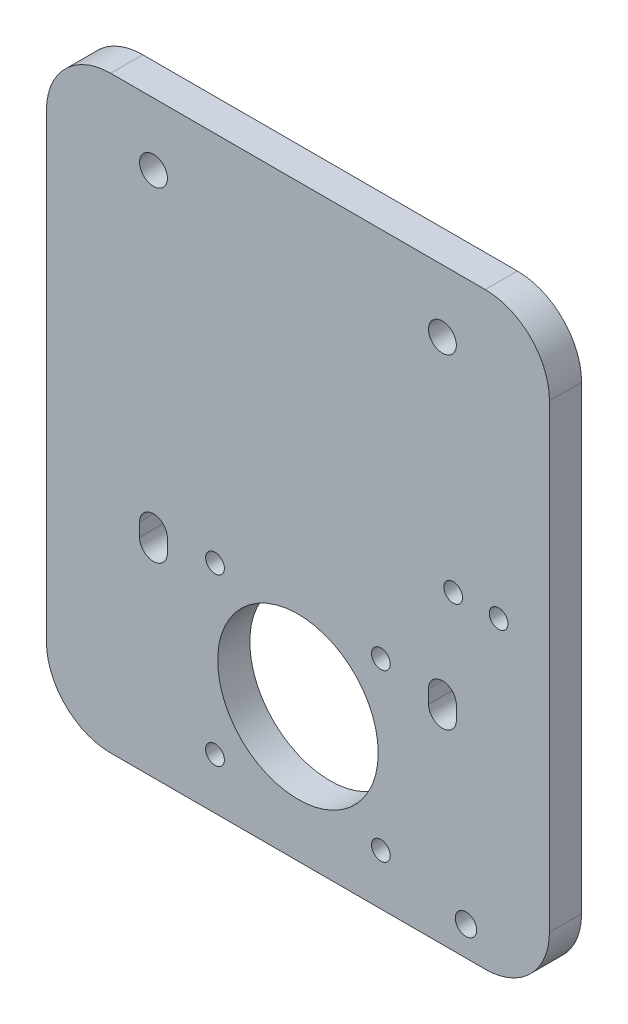
ISO-10303-21;
HEADER;
FILE_DESCRIPTION(('STEP AP214'),'2;1');
FILE_NAME('part.step','',(''),(''),'','','');
FILE_SCHEMA(('AUTOMOTIVE_DESIGN { 1 0 10303 214 1 1 1 1 }'));
ENDSEC;
DATA;
#1=APPLICATION_CONTEXT('core data for automotive mechanical design processes');
#2=APPLICATION_PROTOCOL_DEFINITION('international standard','automotive_design',2000,#1);
#3=PRODUCT_CONTEXT('',#1,'mechanical');
#4=PRODUCT('Part','Part','',(#3));
#5=PRODUCT_RELATED_PRODUCT_CATEGORY('part','',(#4));
#6=PRODUCT_DEFINITION_FORMATION('','',#4);
#7=PRODUCT_DEFINITION_CONTEXT('part definition',#1,'design');
#8=PRODUCT_DEFINITION('design','',#6,#7);
#9=PRODUCT_DEFINITION_SHAPE('','',#8);
#10=(LENGTH_UNIT() NAMED_UNIT(*) SI_UNIT(.MILLI.,.METRE.));
#11=(NAMED_UNIT(*) PLANE_ANGLE_UNIT() SI_UNIT($,.RADIAN.));
#12=(NAMED_UNIT(*) SI_UNIT($,.STERADIAN.) SOLID_ANGLE_UNIT());
#13=UNCERTAINTY_MEASURE_WITH_UNIT(LENGTH_MEASURE(1.E-05),#10,'distance_accuracy_value','');
#14=(GEOMETRIC_REPRESENTATION_CONTEXT(3) GLOBAL_UNCERTAINTY_ASSIGNED_CONTEXT((#13)) GLOBAL_UNIT_ASSIGNED_CONTEXT((#10,
#11,#12)) REPRESENTATION_CONTEXT('',''));
#15=CARTESIAN_POINT('',(0.,0.,0.));
#16=DIRECTION('',(0.,0.,1.));
#17=DIRECTION('',(1.,0.,0.));
#18=AXIS2_PLACEMENT_3D('',#15,#16,#17);
#19=CARTESIAN_POINT('',(27.,37.6,6.));
#20=DIRECTION('',(0.,0.,-1.));
#21=DIRECTION('',(-1.,0.,0.));
#22=AXIS2_PLACEMENT_3D('',#19,#20,#21);
#23=CYLINDRICAL_SURFACE('',#22,2.60000000000222);
#24=CARTESIAN_POINT('',(27.,37.6,0.));
#25=DIRECTION('',(0.,0.,1.));
#26=DIRECTION('',(1.,0.,0.));
#27=AXIS2_PLACEMENT_3D('',#24,#25,#26);
#28=CIRCLE('',#27,2.60000000000222);
#29=CARTESIAN_POINT('',(24.3999999999978,37.6,0.));
#30=VERTEX_POINT('',#29);
#31=CARTESIAN_POINT('',(29.6000000000022,37.6,0.));
#32=VERTEX_POINT('',#31);
#33=EDGE_CURVE('E243',#30,#32,#28,.T.);
#34=ORIENTED_EDGE('',*,*,#33,.F.);
#35=DIRECTION('',(0.,0.,-1.));
#36=VECTOR('',#35,1.);
#37=CARTESIAN_POINT('',(24.3999999999978,37.6,6.));
#38=LINE('',#37,#36);
#39=CARTESIAN_POINT('',(24.3999999999978,37.6,6.));
#40=VERTEX_POINT('',#39);
#41=EDGE_CURVE('E11',#40,#30,#38,.T.);
#42=ORIENTED_EDGE('',*,*,#41,.F.);
#43=CARTESIAN_POINT('',(27.,37.6,6.));
#44=DIRECTION('',(0.,0.,1.));
#45=DIRECTION('',(1.,0.,0.));
#46=AXIS2_PLACEMENT_3D('',#43,#44,#45);
#47=CIRCLE('',#46,2.60000000000222);
#48=CARTESIAN_POINT('',(29.6000000000022,37.6,6.));
#49=VERTEX_POINT('',#48);
#50=EDGE_CURVE('E177',#40,#49,#47,.T.);
#51=ORIENTED_EDGE('',*,*,#50,.T.);
#52=DIRECTION('',(0.,0.,-1.));
#53=VECTOR('',#52,1.);
#54=CARTESIAN_POINT('',(29.6000000000022,37.6,6.));
#55=LINE('',#54,#53);
#56=EDGE_CURVE('E57',#49,#32,#55,.T.);
#57=ORIENTED_EDGE('',*,*,#56,.T.);
#58=EDGE_LOOP('',(#34,#42,#51,#57));
#59=FACE_BOUND('',#58,.T.);
#60=ADVANCED_FACE('F38',(#59),#23,.F.);
#61=CARTESIAN_POINT('',(24.3999999999978,0.,6.));
#62=DIRECTION('',(1.,0.,0.));
#63=DIRECTION('',(0.,0.,-1.));
#64=AXIS2_PLACEMENT_3D('',#61,#62,#63);
#65=PLANE('',#64);
#66=DIRECTION('',(0.,-1.,0.));
#67=VECTOR('',#66,1.);
#68=CARTESIAN_POINT('',(24.3999999999978,0.,0.));
#69=LINE('',#68,#67);
#70=CARTESIAN_POINT('',(24.3999999999978,40.1000000000124,0.));
#71=VERTEX_POINT('',#70);
#72=EDGE_CURVE('E164',#71,#30,#69,.T.);
#73=ORIENTED_EDGE('',*,*,#72,.F.);
#74=DIRECTION('',(0.,0.,-1.));
#75=VECTOR('',#74,1.);
#76=CARTESIAN_POINT('',(24.3999999999978,40.1000000000124,6.));
#77=LINE('',#76,#75);
#78=CARTESIAN_POINT('',(24.3999999999978,40.1000000000124,6.));
#79=VERTEX_POINT('',#78);
#80=EDGE_CURVE('E48',#79,#71,#77,.T.);
#81=ORIENTED_EDGE('',*,*,#80,.F.);
#82=DIRECTION('',(0.,-1.,0.));
#83=VECTOR('',#82,1.);
#84=CARTESIAN_POINT('',(24.3999999999978,0.,6.));
#85=LINE('',#84,#83);
#86=EDGE_CURVE('E162',#79,#40,#85,.T.);
#87=ORIENTED_EDGE('',*,*,#86,.T.);
#88=ORIENTED_EDGE('',*,*,#41,.T.);
#89=EDGE_LOOP('',(#73,#81,#87,#88));
#90=FACE_BOUND('',#89,.T.);
#91=ADVANCED_FACE('F160',(#90),#65,.T.);
#92=CARTESIAN_POINT('',(27.,40.1000000000124,6.));
#93=DIRECTION('',(0.,0.,-1.));
#94=DIRECTION('',(-1.,0.,0.));
#95=AXIS2_PLACEMENT_3D('',#92,#93,#94);
#96=CYLINDRICAL_SURFACE('',#95,2.60000000000222);
#97=CARTESIAN_POINT('',(27.,40.1000000000124,0.));
#98=DIRECTION('',(0.,0.,1.));
#99=DIRECTION('',(1.,0.,0.));
#100=AXIS2_PLACEMENT_3D('',#97,#98,#99);
#101=CIRCLE('',#100,2.60000000000222);
#102=CARTESIAN_POINT('',(29.6000000000022,40.1000000000124,0.));
#103=VERTEX_POINT('',#102);
#104=EDGE_CURVE('E246',#71,#103,#101,.F.);
#105=ORIENTED_EDGE('',*,*,#104,.T.);
#106=DIRECTION('',(0.,0.,-1.));
#107=VECTOR('',#106,1.);
#108=CARTESIAN_POINT('',(29.6000000000022,40.1000000000124,6.));
#109=LINE('',#108,#107);
#110=CARTESIAN_POINT('',(29.6000000000022,40.1000000000124,6.));
#111=VERTEX_POINT('',#110);
#112=EDGE_CURVE('E107',#111,#103,#109,.T.);
#113=ORIENTED_EDGE('',*,*,#112,.F.);
#114=CARTESIAN_POINT('',(27.,40.1000000000124,6.));
#115=DIRECTION('',(0.,0.,1.));
#116=DIRECTION('',(1.,0.,0.));
#117=AXIS2_PLACEMENT_3D('',#114,#115,#116);
#118=CIRCLE('',#117,2.60000000000222);
#119=EDGE_CURVE('E168',#79,#111,#118,.F.);
#120=ORIENTED_EDGE('',*,*,#119,.F.);
#121=ORIENTED_EDGE('',*,*,#80,.T.);
#122=EDGE_LOOP('',(#105,#113,#120,#121));
#123=FACE_BOUND('',#122,.T.);
#124=ADVANCED_FACE('F169',(#123),#96,.F.);
#125=CARTESIAN_POINT('',(-35.,98.,6.));
#126=DIRECTION('',(0.,0.,-1.));
#127=DIRECTION('',(-1.,0.,0.));
#128=AXIS2_PLACEMENT_3D('',#125,#126,#127);
#129=CYLINDRICAL_SURFACE('',#128,12.);
#130=CARTESIAN_POINT('',(-35.,98.,0.));
#131=DIRECTION('',(0.,0.,1.));
#132=DIRECTION('',(1.,0.,0.));
#133=AXIS2_PLACEMENT_3D('',#130,#131,#132);
#134=CIRCLE('',#133,12.);
#135=CARTESIAN_POINT('',(-47.,98.,0.));
#136=VERTEX_POINT('',#135);
#137=CARTESIAN_POINT('',(-35.,110.,0.));
#138=VERTEX_POINT('',#137);
#139=EDGE_CURVE('E210',#136,#138,#134,.F.);
#140=ORIENTED_EDGE('',*,*,#139,.F.);
#141=DIRECTION('',(0.,0.,-1.));
#142=VECTOR('',#141,1.);
#143=CARTESIAN_POINT('',(-47.,98.,6.));
#144=LINE('',#143,#142);
#145=CARTESIAN_POINT('',(-47.,98.,6.));
#146=VERTEX_POINT('',#145);
#147=EDGE_CURVE('E259',#146,#136,#144,.T.);
#148=ORIENTED_EDGE('',*,*,#147,.F.);
#149=CARTESIAN_POINT('',(-35.,98.,6.));
#150=DIRECTION('',(0.,0.,1.));
#151=DIRECTION('',(1.,0.,0.));
#152=AXIS2_PLACEMENT_3D('',#149,#150,#151);
#153=CIRCLE('',#152,12.);
#154=CARTESIAN_POINT('',(-35.,110.,6.));
#155=VERTEX_POINT('',#154);
#156=EDGE_CURVE('E311',#146,#155,#153,.F.);
#157=ORIENTED_EDGE('',*,*,#156,.T.);
#158=DIRECTION('',(0.,0.,-1.));
#159=VECTOR('',#158,1.);
#160=CARTESIAN_POINT('',(-35.,110.,6.));
#161=LINE('',#160,#159);
#162=EDGE_CURVE('E261',#155,#138,#161,.T.);
#163=ORIENTED_EDGE('',*,*,#162,.T.);
#164=EDGE_LOOP('',(#140,#148,#157,#163));
#165=FACE_BOUND('',#164,.T.);
#166=ADVANCED_FACE('F408',(#165),#129,.T.);
#167=CARTESIAN_POINT('',(-47.,0.,6.));
#168=DIRECTION('',(-1.,0.,0.));
#169=DIRECTION('',(0.,-1.,0.));
#170=AXIS2_PLACEMENT_3D('',#167,#168,#169);
#171=PLANE('',#170);
#172=DIRECTION('',(0.,1.,0.));
#173=VECTOR('',#172,1.);
#174=CARTESIAN_POINT('',(-47.,0.,0.));
#175=LINE('',#174,#173);
#176=CARTESIAN_POINT('',(-47.,12.0000000000009,0.));
#177=VERTEX_POINT('',#176);
#178=EDGE_CURVE('E213',#177,#136,#175,.T.);
#179=ORIENTED_EDGE('',*,*,#178,.F.);
#180=DIRECTION('',(0.,0.,-1.));
#181=VECTOR('',#180,1.);
#182=CARTESIAN_POINT('',(-47.,12.0000000000009,6.));
#183=LINE('',#182,#181);
#184=CARTESIAN_POINT('',(-47.,12.0000000000009,6.));
#185=VERTEX_POINT('',#184);
#186=EDGE_CURVE('E273',#185,#177,#183,.T.);
#187=ORIENTED_EDGE('',*,*,#186,.F.);
#188=DIRECTION('',(0.,1.,0.));
#189=VECTOR('',#188,1.);
#190=CARTESIAN_POINT('',(-47.,0.,6.));
#191=LINE('',#190,#189);
#192=EDGE_CURVE('E314',#185,#146,#191,.T.);
#193=ORIENTED_EDGE('',*,*,#192,.T.);
#194=ORIENTED_EDGE('',*,*,#147,.T.);
#195=EDGE_LOOP('',(#179,#187,#193,#194));
#196=FACE_BOUND('',#195,.T.);
#197=ADVANCED_FACE('F404',(#196),#171,.T.);
#198=CARTESIAN_POINT('',(-35.,12.0000000000009,6.));
#199=DIRECTION('',(0.,0.,-1.));
#200=DIRECTION('',(-1.,0.,0.));
#201=AXIS2_PLACEMENT_3D('',#198,#199,#200);
#202=CYLINDRICAL_SURFACE('',#201,12.);
#203=CARTESIAN_POINT('',(-35.,12.0000000000009,0.));
#204=DIRECTION('',(0.,0.,1.));
#205=DIRECTION('',(1.,0.,0.));
#206=AXIS2_PLACEMENT_3D('',#203,#204,#205);
#207=CIRCLE('',#206,12.);
#208=CARTESIAN_POINT('',(-35.,8.88325627822381E-13,0.));
#209=VERTEX_POINT('',#208);
#210=EDGE_CURVE('E216',#177,#209,#207,.T.);
#211=ORIENTED_EDGE('',*,*,#210,.T.);
#212=DIRECTION('',(0.,0.,-1.));
#213=VECTOR('',#212,1.);
#214=CARTESIAN_POINT('',(-35.,8.88325627822381E-13,6.));
#215=LINE('',#214,#213);
#216=CARTESIAN_POINT('',(-35.,8.88325627822381E-13,6.));
#217=VERTEX_POINT('',#216);
#218=EDGE_CURVE('E271',#217,#209,#215,.T.);
#219=ORIENTED_EDGE('',*,*,#218,.F.);
#220=CARTESIAN_POINT('',(-35.,12.0000000000009,6.));
#221=DIRECTION('',(0.,0.,1.));
#222=DIRECTION('',(1.,0.,0.));
#223=AXIS2_PLACEMENT_3D('',#220,#221,#222);
#224=CIRCLE('',#223,12.);
#225=EDGE_CURVE('E317',#185,#217,#224,.T.);
#226=ORIENTED_EDGE('',*,*,#225,.F.);
#227=ORIENTED_EDGE('',*,*,#186,.T.);
#228=EDGE_LOOP('',(#211,#219,#226,#227));
#229=FACE_BOUND('',#228,.T.);
#230=ADVANCED_FACE('F400',(#229),#202,.T.);
#231=CARTESIAN_POINT('',(0.,8.88325627822381E-13,6.));
#232=DIRECTION('',(0.,-1.,0.));
#233=DIRECTION('',(0.,0.,-1.));
#234=AXIS2_PLACEMENT_3D('',#231,#232,#233);
#235=PLANE('',#234);
#236=DIRECTION('',(-1.,0.,0.));
#237=VECTOR('',#236,1.);
#238=CARTESIAN_POINT('',(0.,8.88325627822381E-13,0.));
#239=LINE('',#238,#237);
#240=CARTESIAN_POINT('',(35.,8.88325627822381E-13,0.));
#241=VERTEX_POINT('',#240);
#242=EDGE_CURVE('E219',#241,#209,#239,.T.);
#243=ORIENTED_EDGE('',*,*,#242,.F.);
#244=DIRECTION('',(0.,0.,-1.));
#245=VECTOR('',#244,1.);
#246=CARTESIAN_POINT('',(35.,8.88325627822381E-13,6.));
#247=LINE('',#246,#245);
#248=CARTESIAN_POINT('',(35.,8.88325627822381E-13,6.));
#249=VERTEX_POINT('',#248);
#250=EDGE_CURVE('E269',#249,#241,#247,.T.);
#251=ORIENTED_EDGE('',*,*,#250,.F.);
#252=DIRECTION('',(-1.,0.,0.));
#253=VECTOR('',#252,1.);
#254=CARTESIAN_POINT('',(0.,8.88325627822381E-13,6.));
#255=LINE('',#254,#253);
#256=EDGE_CURVE('E319',#249,#217,#255,.T.);
#257=ORIENTED_EDGE('',*,*,#256,.T.);
#258=ORIENTED_EDGE('',*,*,#218,.T.);
#259=EDGE_LOOP('',(#243,#251,#257,#258));
#260=FACE_BOUND('',#259,.T.);
#261=ADVANCED_FACE('F396',(#260),#235,.T.);
#262=CARTESIAN_POINT('',(35.,12.0000000000009,6.));
#263=DIRECTION('',(0.,0.,-1.));
#264=DIRECTION('',(-1.,0.,0.));
#265=AXIS2_PLACEMENT_3D('',#262,#263,#264);
#266=CYLINDRICAL_SURFACE('',#265,12.);
#267=CARTESIAN_POINT('',(35.,12.0000000000009,0.));
#268=DIRECTION('',(0.,0.,1.));
#269=DIRECTION('',(1.,0.,0.));
#270=AXIS2_PLACEMENT_3D('',#267,#268,#269);
#271=CIRCLE('',#270,12.);
#272=CARTESIAN_POINT('',(47.,12.0000000000009,0.));
#273=VERTEX_POINT('',#272);
#274=EDGE_CURVE('E222',#273,#241,#271,.F.);
#275=ORIENTED_EDGE('',*,*,#274,.F.);
#276=DIRECTION('',(0.,0.,-1.));
#277=VECTOR('',#276,1.);
#278=CARTESIAN_POINT('',(47.,12.0000000000009,6.));
#279=LINE('',#278,#277);
#280=CARTESIAN_POINT('',(47.,12.0000000000009,6.));
#281=VERTEX_POINT('',#280);
#282=EDGE_CURVE('E267',#281,#273,#279,.T.);
#283=ORIENTED_EDGE('',*,*,#282,.F.);
#284=CARTESIAN_POINT('',(35.,12.0000000000009,6.));
#285=DIRECTION('',(0.,0.,1.));
#286=DIRECTION('',(1.,0.,0.));
#287=AXIS2_PLACEMENT_3D('',#284,#285,#286);
#288=CIRCLE('',#287,12.);
#289=EDGE_CURVE('E322',#281,#249,#288,.F.);
#290=ORIENTED_EDGE('',*,*,#289,.T.);
#291=ORIENTED_EDGE('',*,*,#250,.T.);
#292=EDGE_LOOP('',(#275,#283,#290,#291));
#293=FACE_BOUND('',#292,.T.);
#294=ADVANCED_FACE('F392',(#293),#266,.T.);
#295=CARTESIAN_POINT('',(47.,0.,6.));
#296=DIRECTION('',(1.,0.,0.));
#297=DIRECTION('',(0.,0.,-1.));
#298=AXIS2_PLACEMENT_3D('',#295,#296,#297);
#299=PLANE('',#298);
#300=DIRECTION('',(0.,-1.,0.));
#301=VECTOR('',#300,1.);
#302=CARTESIAN_POINT('',(47.,0.,0.));
#303=LINE('',#302,#301);
#304=CARTESIAN_POINT('',(47.,98.,0.));
#305=VERTEX_POINT('',#304);
#306=EDGE_CURVE('E225',#305,#273,#303,.T.);
#307=ORIENTED_EDGE('',*,*,#306,.F.);
#308=DIRECTION('',(0.,0.,-1.));
#309=VECTOR('',#308,1.);
#310=CARTESIAN_POINT('',(47.,98.,6.));
#311=LINE('',#310,#309);
#312=CARTESIAN_POINT('',(47.,98.,6.));
#313=VERTEX_POINT('',#312);
#314=EDGE_CURVE('E265',#313,#305,#311,.T.);
#315=ORIENTED_EDGE('',*,*,#314,.F.);
#316=DIRECTION('',(0.,-1.,0.));
#317=VECTOR('',#316,1.);
#318=CARTESIAN_POINT('',(47.,0.,6.));
#319=LINE('',#318,#317);
#320=EDGE_CURVE('E325',#313,#281,#319,.T.);
#321=ORIENTED_EDGE('',*,*,#320,.T.);
#322=ORIENTED_EDGE('',*,*,#282,.T.);
#323=EDGE_LOOP('',(#307,#315,#321,#322));
#324=FACE_BOUND('',#323,.T.);
#325=ADVANCED_FACE('F388',(#324),#299,.T.);
#326=CARTESIAN_POINT('',(35.,98.,6.));
#327=DIRECTION('',(0.,0.,-1.));
#328=DIRECTION('',(-1.,0.,0.));
#329=AXIS2_PLACEMENT_3D('',#326,#327,#328);
#330=CYLINDRICAL_SURFACE('',#329,12.);
#331=CARTESIAN_POINT('',(35.,98.,0.));
#332=DIRECTION('',(0.,0.,1.));
#333=DIRECTION('',(1.,0.,0.));
#334=AXIS2_PLACEMENT_3D('',#331,#332,#333);
#335=CIRCLE('',#334,12.);
#336=CARTESIAN_POINT('',(35.,110.,0.));
#337=VERTEX_POINT('',#336);
#338=EDGE_CURVE('E228',#337,#305,#335,.F.);
#339=ORIENTED_EDGE('',*,*,#338,.F.);
#340=DIRECTION('',(0.,0.,-1.));
#341=VECTOR('',#340,1.);
#342=CARTESIAN_POINT('',(35.,110.,6.));
#343=LINE('',#342,#341);
#344=CARTESIAN_POINT('',(35.,110.,6.));
#345=VERTEX_POINT('',#344);
#346=EDGE_CURVE('E263',#345,#337,#343,.T.);
#347=ORIENTED_EDGE('',*,*,#346,.F.);
#348=CARTESIAN_POINT('',(35.,98.,6.));
#349=DIRECTION('',(0.,0.,1.));
#350=DIRECTION('',(1.,0.,0.));
#351=AXIS2_PLACEMENT_3D('',#348,#349,#350);
#352=CIRCLE('',#351,12.);
#353=EDGE_CURVE('E328',#345,#313,#352,.F.);
#354=ORIENTED_EDGE('',*,*,#353,.T.);
#355=ORIENTED_EDGE('',*,*,#314,.T.);
#356=EDGE_LOOP('',(#339,#347,#354,#355));
#357=FACE_BOUND('',#356,.T.);
#358=ADVANCED_FACE('F385',(#357),#330,.T.);
#359=CARTESIAN_POINT('',(-27.,40.1000000000124,6.));
#360=DIRECTION('',(0.,0.,-1.));
#361=DIRECTION('',(-1.,0.,0.));
#362=AXIS2_PLACEMENT_3D('',#359,#360,#361);
#363=CYLINDRICAL_SURFACE('',#362,2.60000000000222);
#364=CARTESIAN_POINT('',(-27.,40.1000000000124,0.));
#365=DIRECTION('',(0.,0.,1.));
#366=DIRECTION('',(1.,0.,0.));
#367=AXIS2_PLACEMENT_3D('',#364,#365,#366);
#368=CIRCLE('',#367,2.60000000000222);
#369=CARTESIAN_POINT('',(-24.3999999999978,40.1000000000124,0.));
#370=VERTEX_POINT('',#369);
#371=CARTESIAN_POINT('',(-29.6000000000022,40.1000000000124,0.));
#372=VERTEX_POINT('',#371);
#373=EDGE_CURVE('E191',#370,#372,#368,.T.);
#374=ORIENTED_EDGE('',*,*,#373,.F.);
#375=DIRECTION('',(0.,0.,-1.));
#376=VECTOR('',#375,1.);
#377=CARTESIAN_POINT('',(-24.3999999999978,40.1000000000124,6.));
#378=LINE('',#377,#376);
#379=CARTESIAN_POINT('',(-24.3999999999978,40.1000000000124,6.));
#380=VERTEX_POINT('',#379);
#381=EDGE_CURVE('E42',#380,#370,#378,.T.);
#382=ORIENTED_EDGE('',*,*,#381,.F.);
#383=CARTESIAN_POINT('',(-27.,40.1000000000124,6.));
#384=DIRECTION('',(0.,0.,1.));
#385=DIRECTION('',(1.,0.,0.));
#386=AXIS2_PLACEMENT_3D('',#383,#384,#385);
#387=CIRCLE('',#386,2.60000000000222);
#388=CARTESIAN_POINT('',(-29.6000000000022,40.1000000000124,6.));
#389=VERTEX_POINT('',#388);
#390=EDGE_CURVE('E257',#380,#389,#387,.T.);
#391=ORIENTED_EDGE('',*,*,#390,.T.);
#392=DIRECTION('',(0.,0.,-1.));
#393=VECTOR('',#392,1.);
#394=CARTESIAN_POINT('',(-29.6000000000022,40.1000000000124,6.));
#395=LINE('',#394,#393);
#396=EDGE_CURVE('E190',#389,#372,#395,.T.);
#397=ORIENTED_EDGE('',*,*,#396,.T.);
#398=EDGE_LOOP('',(#374,#382,#391,#397));
#399=FACE_BOUND('',#398,.T.);
#400=ADVANCED_FACE('F40',(#399),#363,.F.);
#401=CARTESIAN_POINT('',(-24.3999999999978,0.,6.));
#402=DIRECTION('',(-1.,0.,0.));
#403=DIRECTION('',(0.,0.,1.));
#404=AXIS2_PLACEMENT_3D('',#401,#402,#403);
#405=PLANE('',#404);
#406=DIRECTION('',(0.,1.,0.));
#407=VECTOR('',#406,1.);
#408=CARTESIAN_POINT('',(-24.3999999999978,0.,0.));
#409=LINE('',#408,#407);
#410=CARTESIAN_POINT('',(-24.3999999999978,37.6,0.));
#411=VERTEX_POINT('',#410);
#412=EDGE_CURVE('E194',#411,#370,#409,.T.);
#413=ORIENTED_EDGE('',*,*,#412,.F.);
#414=DIRECTION('',(0.,0.,-1.));
#415=VECTOR('',#414,1.);
#416=CARTESIAN_POINT('',(-24.3999999999978,37.6,6.));
#417=LINE('',#416,#415);
#418=CARTESIAN_POINT('',(-24.3999999999978,37.6,6.));
#419=VERTEX_POINT('',#418);
#420=EDGE_CURVE('E278',#419,#411,#417,.T.);
#421=ORIENTED_EDGE('',*,*,#420,.F.);
#422=DIRECTION('',(0.,1.,0.));
#423=VECTOR('',#422,1.);
#424=CARTESIAN_POINT('',(-24.3999999999978,0.,6.));
#425=LINE('',#424,#423);
#426=EDGE_CURVE('E287',#419,#380,#425,.T.);
#427=ORIENTED_EDGE('',*,*,#426,.T.);
#428=ORIENTED_EDGE('',*,*,#381,.T.);
#429=EDGE_LOOP('',(#413,#421,#427,#428));
#430=FACE_BOUND('',#429,.T.);
#431=ADVANCED_FACE('F285',(#430),#405,.T.);
#432=CARTESIAN_POINT('',(-27.,37.6,6.));
#433=DIRECTION('',(0.,0.,-1.));
#434=DIRECTION('',(-1.,0.,0.));
#435=AXIS2_PLACEMENT_3D('',#432,#433,#434);
#436=CYLINDRICAL_SURFACE('',#435,2.60000000000222);
#437=CARTESIAN_POINT('',(-27.,37.6,0.));
#438=DIRECTION('',(0.,0.,1.));
#439=DIRECTION('',(1.,0.,0.));
#440=AXIS2_PLACEMENT_3D('',#437,#438,#439);
#441=CIRCLE('',#440,2.60000000000222);
#442=CARTESIAN_POINT('',(-29.6000000000022,37.6,0.));
#443=VERTEX_POINT('',#442);
#444=EDGE_CURVE('E198',#411,#443,#441,.F.);
#445=ORIENTED_EDGE('',*,*,#444,.T.);
#446=DIRECTION('',(0.,0.,-1.));
#447=VECTOR('',#446,1.);
#448=CARTESIAN_POINT('',(-29.6000000000022,37.6,6.));
#449=LINE('',#448,#447);
#450=CARTESIAN_POINT('',(-29.6000000000022,37.6,6.));
#451=VERTEX_POINT('',#450);
#452=EDGE_CURVE('E277',#451,#443,#449,.T.);
#453=ORIENTED_EDGE('',*,*,#452,.F.);
#454=CARTESIAN_POINT('',(-27.,37.6,6.));
#455=DIRECTION('',(0.,0.,1.));
#456=DIRECTION('',(1.,0.,0.));
#457=AXIS2_PLACEMENT_3D('',#454,#455,#456);
#458=CIRCLE('',#457,2.60000000000222);
#459=EDGE_CURVE('E295',#419,#451,#458,.F.);
#460=ORIENTED_EDGE('',*,*,#459,.F.);
#461=ORIENTED_EDGE('',*,*,#420,.T.);
#462=EDGE_LOOP('',(#445,#453,#460,#461));
#463=FACE_BOUND('',#462,.T.);
#464=ADVANCED_FACE('F293',(#463),#436,.F.);
#465=CARTESIAN_POINT('',(27.,98.3000000000124,6.));
#466=DIRECTION('',(0.,0.,-1.));
#467=DIRECTION('',(-1.,0.,0.));
#468=AXIS2_PLACEMENT_3D('',#465,#466,#467);
#469=CYLINDRICAL_SURFACE('',#468,2.6);
#470=CARTESIAN_POINT('',(27.,98.3000000000124,6.));
#471=DIRECTION('',(0.,0.,1.));
#472=DIRECTION('',(1.,0.,0.));
#473=AXIS2_PLACEMENT_3D('',#470,#471,#472);
#474=CIRCLE('',#473,2.6);
#475=CARTESIAN_POINT('',(29.6,98.3000000000124,6.));
#476=VERTEX_POINT('',#475);
#477=EDGE_CURVE('E184',#476,#476,#474,.T.);
#478=ORIENTED_EDGE('',*,*,#477,.T.);
#479=EDGE_LOOP('',(#478));
#480=FACE_BOUND('',#479,.T.);
#481=CARTESIAN_POINT('',(27.,98.3000000000124,0.));
#482=DIRECTION('',(0.,0.,1.));
#483=DIRECTION('',(1.,0.,0.));
#484=AXIS2_PLACEMENT_3D('',#481,#482,#483);
#485=CIRCLE('',#484,2.6);
#486=CARTESIAN_POINT('',(29.6,98.3000000000124,0.));
#487=VERTEX_POINT('',#486);
#488=EDGE_CURVE('E251',#487,#487,#485,.T.);
#489=ORIENTED_EDGE('',*,*,#488,.F.);
#490=EDGE_LOOP('',(#489));
#491=FACE_BOUND('',#490,.T.);
#492=ADVANCED_FACE('F423',(#480,#491),#469,.F.);
#493=CARTESIAN_POINT('',(29.6000000000022,0.,6.));
#494=DIRECTION('',(-1.,0.,0.));
#495=DIRECTION('',(0.,0.,1.));
#496=AXIS2_PLACEMENT_3D('',#493,#494,#495);
#497=PLANE('',#496);
#498=DIRECTION('',(0.,1.,0.));
#499=VECTOR('',#498,1.);
#500=CARTESIAN_POINT('',(29.6000000000022,0.,0.));
#501=LINE('',#500,#499);
#502=EDGE_CURVE('E248',#32,#103,#501,.T.);
#503=ORIENTED_EDGE('',*,*,#502,.F.);
#504=ORIENTED_EDGE('',*,*,#56,.F.);
#505=DIRECTION('',(0.,1.,0.));
#506=VECTOR('',#505,1.);
#507=CARTESIAN_POINT('',(29.6000000000022,0.,6.));
#508=LINE('',#507,#506);
#509=EDGE_CURVE('E172',#49,#111,#508,.T.);
#510=ORIENTED_EDGE('',*,*,#509,.T.);
#511=ORIENTED_EDGE('',*,*,#112,.T.);
#512=EDGE_LOOP('',(#503,#504,#510,#511));
#513=FACE_BOUND('',#512,.T.);
#514=ADVANCED_FACE('F372',(#513),#497,.T.);
#515=CARTESIAN_POINT('',(0.,25.,6.));
#516=DIRECTION('',(0.,0.,-1.));
#517=DIRECTION('',(-1.,0.,0.));
#518=AXIS2_PLACEMENT_3D('',#515,#516,#517);
#519=CYLINDRICAL_SURFACE('',#518,15.);
#520=CARTESIAN_POINT('',(0.,25.,6.));
#521=DIRECTION('',(0.,0.,1.));
#522=DIRECTION('',(1.,0.,0.));
#523=AXIS2_PLACEMENT_3D('',#520,#521,#522);
#524=CIRCLE('',#523,15.);
#525=CARTESIAN_POINT('',(15.,25.,6.));
#526=VERTEX_POINT('',#525);
#527=EDGE_CURVE('E179',#526,#526,#524,.T.);
#528=ORIENTED_EDGE('',*,*,#527,.T.);
#529=EDGE_LOOP('',(#528));
#530=FACE_BOUND('',#529,.T.);
#531=CARTESIAN_POINT('',(0.,25.,0.));
#532=DIRECTION('',(0.,0.,1.));
#533=DIRECTION('',(1.,0.,0.));
#534=AXIS2_PLACEMENT_3D('',#531,#532,#533);
#535=CIRCLE('',#534,15.);
#536=CARTESIAN_POINT('',(15.,25.,0.));
#537=VERTEX_POINT('',#536);
#538=EDGE_CURVE('E240',#537,#537,#535,.T.);
#539=ORIENTED_EDGE('',*,*,#538,.F.);
#540=EDGE_LOOP('',(#539));
#541=FACE_BOUND('',#540,.T.);
#542=ADVANCED_FACE('F342',(#530,#541),#519,.F.);
#543=CARTESIAN_POINT('',(15.5,40.5,6.));
#544=DIRECTION('',(0.,0.,-1.));
#545=DIRECTION('',(-1.,0.,0.));
#546=AXIS2_PLACEMENT_3D('',#543,#544,#545);
#547=CYLINDRICAL_SURFACE('',#546,1.75);
#548=CARTESIAN_POINT('',(15.5,40.5,6.));
#549=DIRECTION('',(0.,0.,1.));
#550=DIRECTION('',(1.,0.,0.));
#551=AXIS2_PLACEMENT_3D('',#548,#549,#550);
#552=CIRCLE('',#551,1.75);
#553=CARTESIAN_POINT('',(17.25,40.5,6.));
#554=VERTEX_POINT('',#553);
#555=EDGE_CURVE('E337',#554,#554,#552,.F.);
#556=ORIENTED_EDGE('',*,*,#555,.F.);
#557=EDGE_LOOP('',(#556));
#558=FACE_BOUND('',#557,.T.);
#559=CARTESIAN_POINT('',(15.5,40.5,0.));
#560=DIRECTION('',(0.,0.,1.));
#561=DIRECTION('',(1.,0.,0.));
#562=AXIS2_PLACEMENT_3D('',#559,#560,#561);
#563=CIRCLE('',#562,1.75);
#564=CARTESIAN_POINT('',(17.25,40.5,0.));
#565=VERTEX_POINT('',#564);
#566=EDGE_CURVE('E237',#565,#565,#563,.F.);
#567=ORIENTED_EDGE('',*,*,#566,.T.);
#568=EDGE_LOOP('',(#567));
#569=FACE_BOUND('',#568,.T.);
#570=ADVANCED_FACE('F371',(#558,#569),#547,.F.);
#571=CARTESIAN_POINT('',(15.5,9.49999999999999,6.));
#572=DIRECTION('',(0.,0.,-1.));
#573=DIRECTION('',(-1.,0.,0.));
#574=AXIS2_PLACEMENT_3D('',#571,#572,#573);
#575=CYLINDRICAL_SURFACE('',#574,1.75);
#576=CARTESIAN_POINT('',(15.5,9.49999999999999,6.));
#577=DIRECTION('',(0.,0.,1.));
#578=DIRECTION('',(1.,0.,0.));
#579=AXIS2_PLACEMENT_3D('',#576,#577,#578);
#580=CIRCLE('',#579,1.75);
#581=CARTESIAN_POINT('',(17.25,9.49999999999999,6.));
#582=VERTEX_POINT('',#581);
#583=EDGE_CURVE('E334',#582,#582,#580,.T.);
#584=ORIENTED_EDGE('',*,*,#583,.T.);
#585=EDGE_LOOP('',(#584));
#586=FACE_BOUND('',#585,.T.);
#587=CARTESIAN_POINT('',(15.5,9.49999999999999,0.));
#588=DIRECTION('',(0.,0.,1.));
#589=DIRECTION('',(1.,0.,0.));
#590=AXIS2_PLACEMENT_3D('',#587,#588,#589);
#591=CIRCLE('',#590,1.75);
#592=CARTESIAN_POINT('',(17.25,9.49999999999999,0.));
#593=VERTEX_POINT('',#592);
#594=EDGE_CURVE('E234',#593,#593,#591,.T.);
#595=ORIENTED_EDGE('',*,*,#594,.F.);
#596=EDGE_LOOP('',(#595));
#597=FACE_BOUND('',#596,.T.);
#598=ADVANCED_FACE('F375',(#586,#597),#575,.F.);
#599=CARTESIAN_POINT('',(0.,110.,6.));
#600=DIRECTION('',(0.,1.,0.));
#601=DIRECTION('',(0.,0.,1.));
#602=AXIS2_PLACEMENT_3D('',#599,#600,#601);
#603=PLANE('',#602);
#604=DIRECTION('',(1.,0.,0.));
#605=VECTOR('',#604,1.);
#606=CARTESIAN_POINT('',(0.,110.,0.));
#607=LINE('',#606,#605);
#608=EDGE_CURVE('E231',#138,#337,#607,.T.);
#609=ORIENTED_EDGE('',*,*,#608,.F.);
#610=ORIENTED_EDGE('',*,*,#162,.F.);
#611=DIRECTION('',(1.,0.,0.));
#612=VECTOR('',#611,1.);
#613=CARTESIAN_POINT('',(0.,110.,6.));
#614=LINE('',#613,#612);
#615=EDGE_CURVE('E331',#155,#345,#614,.T.);
#616=ORIENTED_EDGE('',*,*,#615,.T.);
#617=ORIENTED_EDGE('',*,*,#346,.T.);
#618=EDGE_LOOP('',(#609,#610,#616,#617));
#619=FACE_BOUND('',#618,.T.);
#620=ADVANCED_FACE('F379',(#619),#603,.T.);
#621=CARTESIAN_POINT('',(-15.5,40.5,6.));
#622=DIRECTION('',(0.,0.,-1.));
#623=DIRECTION('',(-1.,0.,0.));
#624=AXIS2_PLACEMENT_3D('',#621,#622,#623);
#625=CYLINDRICAL_SURFACE('',#624,1.75);
#626=CARTESIAN_POINT('',(-15.5,40.5,6.));
#627=DIRECTION('',(0.,0.,1.));
#628=DIRECTION('',(1.,0.,0.));
#629=AXIS2_PLACEMENT_3D('',#626,#627,#628);
#630=CIRCLE('',#629,1.75);
#631=CARTESIAN_POINT('',(-13.75,40.5,6.));
#632=VERTEX_POINT('',#631);
#633=EDGE_CURVE('E304',#632,#632,#630,.T.);
#634=ORIENTED_EDGE('',*,*,#633,.T.);
#635=EDGE_LOOP('',(#634));
#636=FACE_BOUND('',#635,.T.);
#637=CARTESIAN_POINT('',(-15.5,40.5,0.));
#638=DIRECTION('',(0.,0.,1.));
#639=DIRECTION('',(1.,0.,0.));
#640=AXIS2_PLACEMENT_3D('',#637,#638,#639);
#641=CIRCLE('',#640,1.75);
#642=CARTESIAN_POINT('',(-13.75,40.5,0.));
#643=VERTEX_POINT('',#642);
#644=EDGE_CURVE('E207',#643,#643,#641,.T.);
#645=ORIENTED_EDGE('',*,*,#644,.F.);
#646=EDGE_LOOP('',(#645));
#647=FACE_BOUND('',#646,.T.);
#648=ADVANCED_FACE('F383',(#636,#647),#625,.F.);
#649=CARTESIAN_POINT('',(-15.5,9.49999999999998,6.));
#650=DIRECTION('',(0.,0.,-1.));
#651=DIRECTION('',(-1.,0.,0.));
#652=AXIS2_PLACEMENT_3D('',#649,#650,#651);
#653=CYLINDRICAL_SURFACE('',#652,1.75);
#654=CARTESIAN_POINT('',(-15.5,9.49999999999998,6.));
#655=DIRECTION('',(0.,0.,1.));
#656=DIRECTION('',(1.,0.,0.));
#657=AXIS2_PLACEMENT_3D('',#654,#655,#656);
#658=CIRCLE('',#657,1.75);
#659=CARTESIAN_POINT('',(-13.75,9.49999999999998,6.));
#660=VERTEX_POINT('',#659);
#661=EDGE_CURVE('E301',#660,#660,#658,.F.);
#662=ORIENTED_EDGE('',*,*,#661,.F.);
#663=EDGE_LOOP('',(#662));
#664=FACE_BOUND('',#663,.T.);
#665=CARTESIAN_POINT('',(-15.5,9.49999999999998,0.));
#666=DIRECTION('',(0.,0.,1.));
#667=DIRECTION('',(1.,0.,0.));
#668=AXIS2_PLACEMENT_3D('',#665,#666,#667);
#669=CIRCLE('',#668,1.75);
#670=CARTESIAN_POINT('',(-13.75,9.49999999999998,0.));
#671=VERTEX_POINT('',#670);
#672=EDGE_CURVE('E204',#671,#671,#669,.F.);
#673=ORIENTED_EDGE('',*,*,#672,.T.);
#674=EDGE_LOOP('',(#673));
#675=FACE_BOUND('',#674,.T.);
#676=ADVANCED_FACE('F415',(#664,#675),#653,.F.);
#677=CARTESIAN_POINT('',(-29.6000000000022,0.,6.));
#678=DIRECTION('',(1.,0.,0.));
#679=DIRECTION('',(0.,0.,-1.));
#680=AXIS2_PLACEMENT_3D('',#677,#678,#679);
#681=PLANE('',#680);
#682=DIRECTION('',(0.,-1.,0.));
#683=VECTOR('',#682,1.);
#684=CARTESIAN_POINT('',(-29.6000000000022,0.,0.));
#685=LINE('',#684,#683);
#686=EDGE_CURVE('E201',#372,#443,#685,.T.);
#687=ORIENTED_EDGE('',*,*,#686,.F.);
#688=ORIENTED_EDGE('',*,*,#396,.F.);
#689=DIRECTION('',(0.,-1.,0.));
#690=VECTOR('',#689,1.);
#691=CARTESIAN_POINT('',(-29.6000000000022,0.,6.));
#692=LINE('',#691,#690);
#693=EDGE_CURVE('E298',#389,#451,#692,.T.);
#694=ORIENTED_EDGE('',*,*,#693,.T.);
#695=ORIENTED_EDGE('',*,*,#452,.T.);
#696=EDGE_LOOP('',(#687,#688,#694,#695));
#697=FACE_BOUND('',#696,.T.);
#698=ADVANCED_FACE('F299',(#697),#681,.T.);
#699=CARTESIAN_POINT('',(-27.,98.3000000000124,6.));
#700=DIRECTION('',(0.,0.,-1.));
#701=DIRECTION('',(-1.,0.,0.));
#702=AXIS2_PLACEMENT_3D('',#699,#700,#701);
#703=CYLINDRICAL_SURFACE('',#702,2.6);
#704=CARTESIAN_POINT('',(-27.,98.3000000000124,6.));
#705=DIRECTION('',(0.,0.,1.));
#706=DIRECTION('',(1.,0.,0.));
#707=AXIS2_PLACEMENT_3D('',#704,#705,#706);
#708=CIRCLE('',#707,2.6);
#709=CARTESIAN_POINT('',(-24.4,98.3000000000124,6.));
#710=VERTEX_POINT('',#709);
#711=EDGE_CURVE('E187',#710,#710,#708,.F.);
#712=ORIENTED_EDGE('',*,*,#711,.F.);
#713=EDGE_LOOP('',(#712));
#714=FACE_BOUND('',#713,.T.);
#715=CARTESIAN_POINT('',(-27.,98.3000000000124,0.));
#716=DIRECTION('',(0.,0.,1.));
#717=DIRECTION('',(1.,0.,0.));
#718=AXIS2_PLACEMENT_3D('',#715,#716,#717);
#719=CIRCLE('',#718,2.6);
#720=CARTESIAN_POINT('',(-24.4,98.3000000000124,0.));
#721=VERTEX_POINT('',#720);
#722=EDGE_CURVE('E254',#721,#721,#719,.F.);
#723=ORIENTED_EDGE('',*,*,#722,.T.);
#724=EDGE_LOOP('',(#723));
#725=FACE_BOUND('',#724,.T.);
#726=ADVANCED_FACE('F346',(#714,#725),#703,.F.);
#727=CARTESIAN_POINT('',(0.,0.,6.));
#728=DIRECTION('',(0.,0.,1.));
#729=DIRECTION('',(1.,0.,0.));
#730=AXIS2_PLACEMENT_3D('',#727,#728,#729);
#731=PLANE('',#730);
#732=CARTESIAN_POINT('',(31.3948279870499,5.50571160050231,6.));
#733=DIRECTION('',(0.,0.,1.));
#734=DIRECTION('',(1.,0.,0.));
#735=AXIS2_PLACEMENT_3D('',#732,#733,#734);
#736=CIRCLE('',#735,2.);
#737=CARTESIAN_POINT('',(33.3948279870499,5.50571160050231,6.));
#738=VERTEX_POINT('',#737);
#739=EDGE_CURVE('E686',#738,#738,#736,.T.);
#740=ORIENTED_EDGE('',*,*,#739,.F.);
#741=EDGE_LOOP('',(#740));
#742=FACE_BOUND('',#741,.T.);
#743=CARTESIAN_POINT('',(37.5,58.0000000000009,6.));
#744=DIRECTION('',(0.,0.,1.));
#745=DIRECTION('',(1.,0.,0.));
#746=AXIS2_PLACEMENT_3D('',#743,#744,#745);
#747=CIRCLE('',#746,1.75);
#748=CARTESIAN_POINT('',(39.25,58.0000000000009,6.));
#749=VERTEX_POINT('',#748);
#750=EDGE_CURVE('E693',#749,#749,#747,.T.);
#751=ORIENTED_EDGE('',*,*,#750,.F.);
#752=EDGE_LOOP('',(#751));
#753=FACE_BOUND('',#752,.T.);
#754=CARTESIAN_POINT('',(29.,58.0000000000009,6.));
#755=DIRECTION('',(0.,0.,1.));
#756=DIRECTION('',(1.,0.,0.));
#757=AXIS2_PLACEMENT_3D('',#754,#755,#756);
#758=CIRCLE('',#757,1.75);
#759=CARTESIAN_POINT('',(30.75,58.0000000000009,6.));
#760=VERTEX_POINT('',#759);
#761=EDGE_CURVE('E195',#760,#760,#758,.T.);
#762=ORIENTED_EDGE('',*,*,#761,.F.);
#763=EDGE_LOOP('',(#762));
#764=FACE_BOUND('',#763,.T.);
#765=ORIENTED_EDGE('',*,*,#390,.F.);
#766=ORIENTED_EDGE('',*,*,#426,.F.);
#767=ORIENTED_EDGE('',*,*,#459,.T.);
#768=ORIENTED_EDGE('',*,*,#693,.F.);
#769=EDGE_LOOP('',(#765,#766,#767,#768));
#770=FACE_BOUND('',#769,.T.);
#771=ORIENTED_EDGE('',*,*,#661,.T.);
#772=EDGE_LOOP('',(#771));
#773=FACE_BOUND('',#772,.T.);
#774=ORIENTED_EDGE('',*,*,#633,.F.);
#775=EDGE_LOOP('',(#774));
#776=FACE_BOUND('',#775,.T.);
#777=ORIENTED_EDGE('',*,*,#156,.F.);
#778=ORIENTED_EDGE('',*,*,#192,.F.);
#779=ORIENTED_EDGE('',*,*,#225,.T.);
#780=ORIENTED_EDGE('',*,*,#256,.F.);
#781=ORIENTED_EDGE('',*,*,#289,.F.);
#782=ORIENTED_EDGE('',*,*,#320,.F.);
#783=ORIENTED_EDGE('',*,*,#353,.F.);
#784=ORIENTED_EDGE('',*,*,#615,.F.);
#785=EDGE_LOOP('',(#777,#778,#779,#780,#781,#782,#783,#784));
#786=FACE_BOUND('',#785,.T.);
#787=ORIENTED_EDGE('',*,*,#583,.F.);
#788=EDGE_LOOP('',(#787));
#789=FACE_BOUND('',#788,.T.);
#790=ORIENTED_EDGE('',*,*,#555,.T.);
#791=EDGE_LOOP('',(#790));
#792=FACE_BOUND('',#791,.T.);
#793=ORIENTED_EDGE('',*,*,#527,.F.);
#794=EDGE_LOOP('',(#793));
#795=FACE_BOUND('',#794,.T.);
#796=ORIENTED_EDGE('',*,*,#50,.F.);
#797=ORIENTED_EDGE('',*,*,#86,.F.);
#798=ORIENTED_EDGE('',*,*,#119,.T.);
#799=ORIENTED_EDGE('',*,*,#509,.F.);
#800=EDGE_LOOP('',(#796,#797,#798,#799));
#801=FACE_BOUND('',#800,.T.);
#802=ORIENTED_EDGE('',*,*,#477,.F.);
#803=EDGE_LOOP('',(#802));
#804=FACE_BOUND('',#803,.T.);
#805=ORIENTED_EDGE('',*,*,#711,.T.);
#806=EDGE_LOOP('',(#805));
#807=FACE_BOUND('',#806,.T.);
#808=ADVANCED_FACE('F175',(#742,#753,#764,#770,#773,#776,#786,#789,#792,#795,#801,#804,#807),
#731,.T.);
#809=CARTESIAN_POINT('',(0.,0.,0.));
#810=DIRECTION('',(0.,0.,1.));
#811=DIRECTION('',(1.,0.,0.));
#812=AXIS2_PLACEMENT_3D('',#809,#810,#811);
#813=PLANE('',#812);
#814=CARTESIAN_POINT('',(31.3948279870499,5.50571160050231,0.));
#815=DIRECTION('',(0.,0.,1.));
#816=DIRECTION('',(1.,0.,0.));
#817=AXIS2_PLACEMENT_3D('',#814,#815,#816);
#818=CIRCLE('',#817,2.);
#819=CARTESIAN_POINT('',(33.3948279870499,5.50571160050231,0.));
#820=VERTEX_POINT('',#819);
#821=EDGE_CURVE('E684',#820,#820,#818,.T.);
#822=ORIENTED_EDGE('',*,*,#821,.T.);
#823=EDGE_LOOP('',(#822));
#824=FACE_BOUND('',#823,.T.);
#825=CARTESIAN_POINT('',(37.5,58.0000000000009,0.));
#826=DIRECTION('',(0.,0.,-1.));
#827=DIRECTION('',(-1.,0.,0.));
#828=AXIS2_PLACEMENT_3D('',#825,#826,#827);
#829=CIRCLE('',#828,1.75);
#830=CARTESIAN_POINT('',(35.75,58.0000000000009,0.));
#831=VERTEX_POINT('',#830);
#832=EDGE_CURVE('E688',#831,#831,#829,.T.);
#833=ORIENTED_EDGE('',*,*,#832,.F.);
#834=EDGE_LOOP('',(#833));
#835=FACE_BOUND('',#834,.T.);
#836=CARTESIAN_POINT('',(29.,58.0000000000009,0.));
#837=DIRECTION('',(0.,0.,-1.));
#838=DIRECTION('',(-1.,0.,0.));
#839=AXIS2_PLACEMENT_3D('',#836,#837,#838);
#840=CIRCLE('',#839,1.75);
#841=CARTESIAN_POINT('',(27.25,58.0000000000009,0.));
#842=VERTEX_POINT('',#841);
#843=EDGE_CURVE('E696',#842,#842,#840,.T.);
#844=ORIENTED_EDGE('',*,*,#843,.F.);
#845=EDGE_LOOP('',(#844));
#846=FACE_BOUND('',#845,.T.);
#847=ORIENTED_EDGE('',*,*,#373,.T.);
#848=ORIENTED_EDGE('',*,*,#686,.T.);
#849=ORIENTED_EDGE('',*,*,#444,.F.);
#850=ORIENTED_EDGE('',*,*,#412,.T.);
#851=EDGE_LOOP('',(#847,#848,#849,#850));
#852=FACE_BOUND('',#851,.T.);
#853=ORIENTED_EDGE('',*,*,#672,.F.);
#854=EDGE_LOOP('',(#853));
#855=FACE_BOUND('',#854,.T.);
#856=ORIENTED_EDGE('',*,*,#644,.T.);
#857=EDGE_LOOP('',(#856));
#858=FACE_BOUND('',#857,.T.);
#859=ORIENTED_EDGE('',*,*,#139,.T.);
#860=ORIENTED_EDGE('',*,*,#608,.T.);
#861=ORIENTED_EDGE('',*,*,#338,.T.);
#862=ORIENTED_EDGE('',*,*,#306,.T.);
#863=ORIENTED_EDGE('',*,*,#274,.T.);
#864=ORIENTED_EDGE('',*,*,#242,.T.);
#865=ORIENTED_EDGE('',*,*,#210,.F.);
#866=ORIENTED_EDGE('',*,*,#178,.T.);
#867=EDGE_LOOP('',(#859,#860,#861,#862,#863,#864,#865,#866));
#868=FACE_BOUND('',#867,.T.);
#869=ORIENTED_EDGE('',*,*,#594,.T.);
#870=EDGE_LOOP('',(#869));
#871=FACE_BOUND('',#870,.T.);
#872=ORIENTED_EDGE('',*,*,#566,.F.);
#873=EDGE_LOOP('',(#872));
#874=FACE_BOUND('',#873,.T.);
#875=ORIENTED_EDGE('',*,*,#538,.T.);
#876=EDGE_LOOP('',(#875));
#877=FACE_BOUND('',#876,.T.);
#878=ORIENTED_EDGE('',*,*,#33,.T.);
#879=ORIENTED_EDGE('',*,*,#502,.T.);
#880=ORIENTED_EDGE('',*,*,#104,.F.);
#881=ORIENTED_EDGE('',*,*,#72,.T.);
#882=EDGE_LOOP('',(#878,#879,#880,#881));
#883=FACE_BOUND('',#882,.T.);
#884=ORIENTED_EDGE('',*,*,#488,.T.);
#885=EDGE_LOOP('',(#884));
#886=FACE_BOUND('',#885,.T.);
#887=ORIENTED_EDGE('',*,*,#722,.F.);
#888=EDGE_LOOP('',(#887));
#889=FACE_BOUND('',#888,.T.);
#890=ADVANCED_FACE('F290',(#824,#835,#846,#852,#855,#858,#868,#871,#874,#877,#883,#886,#889),
#813,.F.);
#891=CARTESIAN_POINT('',(29.,58.0000000000009,10.));
#892=DIRECTION('',(0.,0.,-1.));
#893=DIRECTION('',(-1.,0.,0.));
#894=AXIS2_PLACEMENT_3D('',#891,#892,#893);
#895=CYLINDRICAL_SURFACE('',#894,1.75);
#896=ORIENTED_EDGE('',*,*,#761,.T.);
#897=EDGE_LOOP('',(#896));
#898=FACE_BOUND('',#897,.T.);
#899=ORIENTED_EDGE('',*,*,#843,.T.);
#900=EDGE_LOOP('',(#899));
#901=FACE_BOUND('',#900,.T.);
#902=ADVANCED_FACE('F353',(#898,#901),#895,.F.);
#903=CARTESIAN_POINT('',(37.5,58.0000000000009,10.));
#904=DIRECTION('',(0.,0.,-1.));
#905=DIRECTION('',(-1.,0.,0.));
#906=AXIS2_PLACEMENT_3D('',#903,#904,#905);
#907=CYLINDRICAL_SURFACE('',#906,1.75);
#908=ORIENTED_EDGE('',*,*,#750,.T.);
#909=EDGE_LOOP('',(#908));
#910=FACE_BOUND('',#909,.T.);
#911=ORIENTED_EDGE('',*,*,#832,.T.);
#912=EDGE_LOOP('',(#911));
#913=FACE_BOUND('',#912,.T.);
#914=ADVANCED_FACE('F496',(#910,#913),#907,.F.);
#915=CARTESIAN_POINT('',(31.3948279870499,5.50571160050231,0.));
#916=DIRECTION('',(0.,0.,1.));
#917=DIRECTION('',(1.,0.,0.));
#918=AXIS2_PLACEMENT_3D('',#915,#916,#917);
#919=CYLINDRICAL_SURFACE('',#918,2.);
#920=ORIENTED_EDGE('',*,*,#821,.F.);
#921=EDGE_LOOP('',(#920));
#922=FACE_BOUND('',#921,.T.);
#923=ORIENTED_EDGE('',*,*,#739,.T.);
#924=EDGE_LOOP('',(#923));
#925=FACE_BOUND('',#924,.T.);
#926=ADVANCED_FACE('F501',(#922,#925),#919,.F.);
#927=CLOSED_SHELL('',(#60,#91,#124,#166,#197,#230,#261,#294,#325,#358,#400,#431,#464,#492,#514,
#542,#570,#598,#620,#648,#676,#698,#726,#808,#890,#902,#914,#926));
#928=MANIFOLD_SOLID_BREP('B2',#927);
#929=ADVANCED_BREP_SHAPE_REPRESENTATION('',(#18,#928),#14);
#930=SHAPE_DEFINITION_REPRESENTATION(#9,#929);
ENDSEC;
END-ISO-10303-21;
